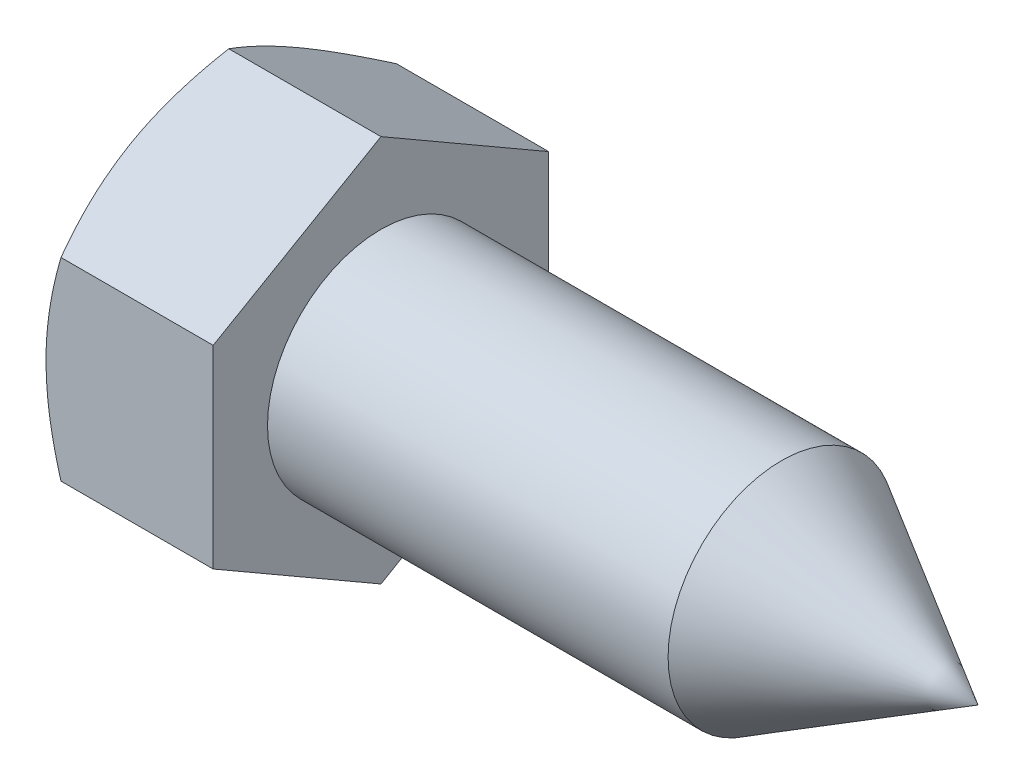
ISO-10303-21;
HEADER;
FILE_DESCRIPTION(('STEP AP214'),'2;1');
FILE_NAME('part.step','',(''),(''),'','','');
FILE_SCHEMA(('AUTOMOTIVE_DESIGN { 1 0 10303 214 1 1 1 1 }'));
ENDSEC;
DATA;
#1=APPLICATION_CONTEXT('core data for automotive mechanical design processes');
#2=APPLICATION_PROTOCOL_DEFINITION('international standard','automotive_design',2000,#1);
#3=PRODUCT_CONTEXT('',#1,'mechanical');
#4=PRODUCT('Part','Part','',(#3));
#5=PRODUCT_RELATED_PRODUCT_CATEGORY('part','',(#4));
#6=PRODUCT_DEFINITION_FORMATION('','',#4);
#7=PRODUCT_DEFINITION_CONTEXT('part definition',#1,'design');
#8=PRODUCT_DEFINITION('design','',#6,#7);
#9=PRODUCT_DEFINITION_SHAPE('','',#8);
#10=(LENGTH_UNIT() NAMED_UNIT(*) SI_UNIT(.MILLI.,.METRE.));
#11=(NAMED_UNIT(*) PLANE_ANGLE_UNIT() SI_UNIT($,.RADIAN.));
#12=(NAMED_UNIT(*) SI_UNIT($,.STERADIAN.) SOLID_ANGLE_UNIT());
#13=UNCERTAINTY_MEASURE_WITH_UNIT(LENGTH_MEASURE(1.E-05),#10,'distance_accuracy_value','');
#14=(GEOMETRIC_REPRESENTATION_CONTEXT(3) GLOBAL_UNCERTAINTY_ASSIGNED_CONTEXT((#13)) GLOBAL_UNIT_ASSIGNED_CONTEXT((#10,
#11,#12)) REPRESENTATION_CONTEXT('',''));
#15=CARTESIAN_POINT('',(0.,0.,0.));
#16=DIRECTION('',(0.,0.,1.));
#17=DIRECTION('',(1.,0.,0.));
#18=AXIS2_PLACEMENT_3D('',#15,#16,#17);
#19=CARTESIAN_POINT('',(3.556,2.06038990565702,-3.5687));
#20=DIRECTION('',(0.,-0.866025403784438,0.500000000000001));
#21=DIRECTION('',(0.,-0.500000000000001,-0.866025403784438));
#22=AXIS2_PLACEMENT_3D('',#19,#20,#21);
#23=PLANE('',#22);
#24=CARTESIAN_POINT('',(0.318810097145046,4.12089528136788,0.0002));
#25=CARTESIAN_POINT('',(0.266515217416026,4.03035167450494,-0.156626127387163));
#26=CARTESIAN_POINT('',(0.218954924924666,3.93902650081488,-0.314805968228382));
#27=CARTESIAN_POINT('',(0.135937943389388,3.75479476029581,-0.633904703174268));
#28=CARTESIAN_POINT('',(0.100510622721651,3.6618849199142,-0.794829267238323));
#29=CARTESIAN_POINT('',(0.045362817821156,3.47721668274375,-1.11468403656172));
#30=CARTESIAN_POINT('',(0.0252752961132202,3.38548669950588,-1.27356502810715));
#31=CARTESIAN_POINT('',(0.00129493211348879,3.20159510929359,-1.59207460543947));
#32=CARTESIAN_POINT('',(-0.00261776794875633,3.10943417072098,-1.75170203352046));
#33=CARTESIAN_POINT('',(0.00552175541747567,2.93722612416988,-2.04997511961916));
#34=CARTESIAN_POINT('',(0.0155754497043311,2.85715323807381,-2.18866542664622));
#35=CARTESIAN_POINT('',(0.0474398366827768,2.69752914050718,-2.46514247374396));
#36=CARTESIAN_POINT('',(0.0692614144390112,2.61797848115061,-2.60292825752515));
#37=CARTESIAN_POINT('',(0.123813701157124,2.45802526555895,-2.87997535376391));
#38=CARTESIAN_POINT('',(0.156775656949125,2.37764295409555,-3.01920160124835));
#39=CARTESIAN_POINT('',(0.231586346267413,2.21807721924434,-3.29557756115772));
#40=CARTESIAN_POINT('',(0.273417501690484,2.13889175156046,-3.43273081440729));
#41=CARTESIAN_POINT('',(0.318810097145042,2.06027443560318,-3.5689));
#42=B_SPLINE_CURVE_WITH_KNOTS('',3,(#24,#25,#26,#27,#28,#29,#30,#31,#32,#33,#34,#35,#36,#37,#38,
#39,#40,#41),.UNSPECIFIED.,.F.,.F.,(4,2,2,2,2,2,2,2,4),(0.,0.565683332870988,1.1327264057399,
1.6857353770667,2.23806521926908,2.71899067080617,3.20036173401453,3.69241045370838,
4.18349293555236),.UNSPECIFIED.);
#43=CARTESIAN_POINT('',(0.318743427676317,4.12077981131404,0.));
#44=VERTEX_POINT('',#43);
#45=CARTESIAN_POINT('',(0.,3.09058485848552,-1.78435000000001));
#46=VERTEX_POINT('',#45);
#47=EDGE_CURVE('E53',#44,#46,#42,.T.);
#48=ORIENTED_EDGE('',*,*,#47,.F.);
#49=DIRECTION('',(-1.,0.,0.));
#50=VECTOR('',#49,1.);
#51=CARTESIAN_POINT('',(3.556,4.12077981131404,0.));
#52=LINE('',#51,#50);
#53=CARTESIAN_POINT('',(3.556,4.12077981131404,0.));
#54=VERTEX_POINT('',#53);
#55=EDGE_CURVE('E152',#54,#44,#52,.T.);
#56=ORIENTED_EDGE('',*,*,#55,.F.);
#57=DIRECTION('',(0.,0.500000000000001,0.866025403784438));
#58=VECTOR('',#57,1.);
#59=CARTESIAN_POINT('',(3.556,2.06038990565702,-3.5687));
#60=LINE('',#59,#58);
#61=CARTESIAN_POINT('',(3.556,2.06038990565702,-3.5687));
#62=VERTEX_POINT('',#61);
#63=EDGE_CURVE('E243',#62,#54,#60,.T.);
#64=ORIENTED_EDGE('',*,*,#63,.F.);
#65=DIRECTION('',(-1.,0.,0.));
#66=VECTOR('',#65,1.);
#67=CARTESIAN_POINT('',(3.556,2.06038990565702,-3.5687));
#68=LINE('',#67,#66);
#69=CARTESIAN_POINT('',(0.318743427676313,2.06038990565702,-3.5687));
#70=VERTEX_POINT('',#69);
#71=EDGE_CURVE('E140',#62,#70,#68,.T.);
#72=ORIENTED_EDGE('',*,*,#71,.T.);
#73=EDGE_CURVE('E134',#46,#70,#42,.T.);
#74=ORIENTED_EDGE('',*,*,#73,.F.);
#75=EDGE_LOOP('',(#48,#56,#64,#72,#74));
#76=FACE_BOUND('',#75,.T.);
#77=ADVANCED_FACE('F37',(#76),#23,.F.);
#78=CARTESIAN_POINT('',(3.556,4.12077981131404,0.));
#79=DIRECTION('',(0.,-0.866025403784438,-0.500000000000001));
#80=DIRECTION('',(0.,0.500000000000001,-0.866025403784438));
#81=AXIS2_PLACEMENT_3D('',#78,#79,#80);
#82=PLANE('',#81);
#83=CARTESIAN_POINT('',(0.318810097145043,2.06027443560318,3.5689));
#84=CARTESIAN_POINT('',(0.266515217416023,2.15081804246613,3.41207387261284));
#85=CARTESIAN_POINT('',(0.218954924924663,2.24214321615618,3.25389403177162));
#86=CARTESIAN_POINT('',(0.135937943389386,2.42637495667525,2.93479529682573));
#87=CARTESIAN_POINT('',(0.100510622721649,2.51928479705686,2.77387073276168));
#88=CARTESIAN_POINT('',(0.0453628178211547,2.70395303422731,2.45401596343828));
#89=CARTESIAN_POINT('',(0.0252752961132193,2.79568301746518,2.29513497189285));
#90=CARTESIAN_POINT('',(0.00129493211348872,2.97957460767747,1.97662539456053));
#91=CARTESIAN_POINT('',(-0.0026177679487559,3.07173554625007,1.81699796647954));
#92=CARTESIAN_POINT('',(0.00552175541747694,3.24394359280118,1.51872488038084));
#93=CARTESIAN_POINT('',(0.0155754497043328,3.32401647889725,1.38003457335378));
#94=CARTESIAN_POINT('',(0.0474398366827791,3.48364057646388,1.10355752625604));
#95=CARTESIAN_POINT('',(0.0692614144390138,3.56319123582045,0.96577174247485));
#96=CARTESIAN_POINT('',(0.123813701157127,3.72314445141211,0.688724646236087));
#97=CARTESIAN_POINT('',(0.156775656949128,3.80352676287551,0.549498398751652));
#98=CARTESIAN_POINT('',(0.231586346267417,3.96309249772672,0.273122438842281));
#99=CARTESIAN_POINT('',(0.273417501690488,4.04227796541059,0.135969185592712));
#100=CARTESIAN_POINT('',(0.318810097145046,4.12089528136788,-0.000200000000000131));
#101=B_SPLINE_CURVE_WITH_KNOTS('',3,(#83,#84,#85,#86,#87,#88,#89,#90,#91,#92,#93,#94,#95,#96,
#97,#98,#99,#100),.UNSPECIFIED.,.F.,.F.,(4,2,2,2,2,2,2,2,4),(0.,0.565683332870988,
1.13272640573989,1.6857353770667,2.23806521926908,2.71899067080616,3.20036173401453,
3.69241045370838,4.18349293555236),.UNSPECIFIED.);
#102=CARTESIAN_POINT('',(0.318743427676313,2.06038990565702,3.5687));
#103=VERTEX_POINT('',#102);
#104=CARTESIAN_POINT('',(0.,3.09058485848552,1.78435));
#105=VERTEX_POINT('',#104);
#106=EDGE_CURVE('E60',#103,#105,#101,.T.);
#107=ORIENTED_EDGE('',*,*,#106,.F.);
#108=DIRECTION('',(-1.,0.,0.));
#109=VECTOR('',#108,1.);
#110=CARTESIAN_POINT('',(3.556,2.06038990565702,3.5687));
#111=LINE('',#110,#109);
#112=CARTESIAN_POINT('',(3.556,2.06038990565702,3.5687));
#113=VERTEX_POINT('',#112);
#114=EDGE_CURVE('E150',#113,#103,#111,.T.);
#115=ORIENTED_EDGE('',*,*,#114,.F.);
#116=DIRECTION('',(0.,-0.500000000000001,0.866025403784438));
#117=VECTOR('',#116,1.);
#118=CARTESIAN_POINT('',(3.556,4.12077981131404,0.));
#119=LINE('',#118,#117);
#120=EDGE_CURVE('E241',#54,#113,#119,.T.);
#121=ORIENTED_EDGE('',*,*,#120,.F.);
#122=ORIENTED_EDGE('',*,*,#55,.T.);
#123=EDGE_CURVE('E167',#105,#44,#101,.T.);
#124=ORIENTED_EDGE('',*,*,#123,.F.);
#125=EDGE_LOOP('',(#107,#115,#121,#122,#124));
#126=FACE_BOUND('',#125,.T.);
#127=ADVANCED_FACE('F173',(#126),#82,.F.);
#128=CARTESIAN_POINT('',(3.556,2.06038990565702,3.5687));
#129=DIRECTION('',(0.,0.,-1.));
#130=DIRECTION('',(0.,1.,0.));
#131=AXIS2_PLACEMENT_3D('',#128,#129,#130);
#132=PLANE('',#131);
#133=CARTESIAN_POINT('',(1.74622749310814,-5.54395061050737,3.5687));
#134=CARTESIAN_POINT('',(1.67051777621743,-5.38795550484438,3.5687));
#135=CARTESIAN_POINT('',(1.5955314429353,-5.23160321945791,3.5687));
#136=CARTESIAN_POINT('',(1.44741236458266,-4.91799428717788,3.5687));
#137=CARTESIAN_POINT('',(1.3742799102078,-4.76073750314063,3.5687));
#138=CARTESIAN_POINT('',(1.22990977600629,-4.44432444545381,3.5687));
#139=CARTESIAN_POINT('',(1.15868448832882,-4.28516249810118,3.5687));
#140=CARTESIAN_POINT('',(1.01913753814225,-3.96557544301869,3.5687));
#141=CARTESIAN_POINT('',(0.95081573881303,-3.80515039523269,3.5687));
#142=CARTESIAN_POINT('',(0.815731463186701,-3.47766449003495,3.5687));
#143=CARTESIAN_POINT('',(0.749087240852181,-3.31055458761518,3.5687));
#144=CARTESIAN_POINT('',(0.620819773725147,-2.97438349497214,3.5687));
#145=CARTESIAN_POINT('',(0.559197090615692,-2.80532208887186,3.5687));
#146=CARTESIAN_POINT('',(0.442582712862686,-2.46529194908488,3.5687));
#147=CARTESIAN_POINT('',(0.387577702535766,-2.2943278282071,3.5687));
#148=CARTESIAN_POINT('',(0.285956965795507,-1.94994775659267,3.5687));
#149=CARTESIAN_POINT('',(0.23933860938547,-1.7765325929499,3.5687));
#150=CARTESIAN_POINT('',(0.156957853670324,-1.42806668033393,3.5687));
#151=CARTESIAN_POINT('',(0.12113920966847,-1.25302947710717,3.5687));
#152=CARTESIAN_POINT('',(0.0623938669874265,-0.900769393934736,3.5687));
#153=CARTESIAN_POINT('',(0.0394658448948095,-0.72354674026776,3.5687));
#154=CARTESIAN_POINT('',(0.00863023714905464,-0.37011966721301,3.5687));
#155=CARTESIAN_POINT('',(0.000528744656555413,-0.193932593095181,3.5687));
#156=CARTESIAN_POINT('',(-0.000477974142601491,0.158502507405787,3.5687));
#157=CARTESIAN_POINT('',(0.0066173083203833,0.334750535632083,3.5687));
#158=CARTESIAN_POINT('',(0.0310306729024779,0.633605639042993,3.5687));
#159=CARTESIAN_POINT('',(0.044668243102702,0.756531848847546,3.5687));
#160=CARTESIAN_POINT('',(0.0784929317357435,1.00148593248935,3.5687));
#161=CARTESIAN_POINT('',(0.0986809268438413,1.12351368384465,3.5687));
#162=CARTESIAN_POINT('',(0.168009386367951,1.4880788364708,3.5687));
#163=CARTESIAN_POINT('',(0.225902503056639,1.72897038443455,3.5687));
#164=CARTESIAN_POINT('',(0.326346974085599,2.08934043892819,3.5687));
#165=CARTESIAN_POINT('',(0.36259143061235,2.2106829045194,3.5687));
#166=CARTESIAN_POINT('',(0.438852048327797,2.45218827079757,3.5687));
#167=CARTESIAN_POINT('',(0.478868238605861,2.57235116237922,3.5687));
#168=CARTESIAN_POINT('',(0.56202932500522,2.81153787870989,3.5687));
#169=CARTESIAN_POINT('',(0.605173252886895,2.93056204316328,3.5687));
#170=CARTESIAN_POINT('',(0.694081320859438,3.16762124759599,3.5687));
#171=CARTESIAN_POINT('',(0.739845397472404,3.28565631145873,3.5687));
#172=CARTESIAN_POINT('',(0.869419332026504,3.61086868189307,3.5687));
#173=CARTESIAN_POINT('',(0.955538742219887,3.81712501305578,3.5687));
#174=CARTESIAN_POINT('',(1.13276906643576,4.2274898596246,3.5687));
#175=CARTESIAN_POINT('',(1.22388055613104,4.43159812407269,3.5687));
#176=CARTESIAN_POINT('',(1.40987223379174,4.83817281264892,3.5687));
#177=CARTESIAN_POINT('',(1.50475375772842,5.040638623585,3.5687));
#178=CARTESIAN_POINT('',(1.69736644071166,5.44421306340702,3.5687));
#179=CARTESIAN_POINT('',(1.79509768649081,5.64532165075536,3.5687));
#180=CARTESIAN_POINT('',(1.99292343206925,6.04676617423498,3.5687));
#181=CARTESIAN_POINT('',(2.09302142430872,6.24710038583299,3.5687));
#182=CARTESIAN_POINT('',(2.29496624487297,6.64688632700477,3.5687));
#183=CARTESIAN_POINT('',(2.39681309095373,6.84633804759281,3.5687));
#184=CARTESIAN_POINT('',(2.70438335949638,7.44353118517559,3.5687));
#185=CARTESIAN_POINT('',(2.91218250565527,7.84020301723298,3.5687));
#186=CARTESIAN_POINT('',(3.30854582607472,8.58837693176025,3.5687));
#187=CARTESIAN_POINT('',(3.49673184692142,8.94008030006754,3.5687));
#188=CARTESIAN_POINT('',(3.8752366316608,9.64236601379057,3.5687));
#189=CARTESIAN_POINT('',(4.06555553119024,9.99294828606892,3.5687));
#190=CARTESIAN_POINT('',(4.44713172461165,10.6920944158896,3.5687));
#191=CARTESIAN_POINT('',(4.6383838237378,11.0406611128841,3.5687));
#192=CARTESIAN_POINT('',(5.02208870539511,11.7370971065676,3.5687));
#193=CARTESIAN_POINT('',(5.21454139112981,12.0849664565665,3.5687));
#194=CARTESIAN_POINT('',(5.40742954459759,12.432592743865,3.5687));
#195=B_SPLINE_CURVE_WITH_KNOTS('',3,(#133,#134,#135,#136,#137,#138,#139,#140,#141,#142,#143,
#144,#145,#146,#147,#148,#149,#150,#151,#152,#153,#154,#155,#156,#157,#158,#159,#160,#161,#162,
#163,#164,#165,#166,#167,#168,#169,#170,#171,#172,#173,#174,#175,#176,#177,#178,#179,#180,#181,
#182,#183,#184,#185,#186,#187,#188,#189,#190,#191,#192,#193,#194),.UNSPECIFIED.,.F.,.F.,(4,2,2,
2,2,2,2,2,2,2,2,2,2,2,2,2,2,2,2,2,2,2,2,2,2,2,2,2,2,2,4),(0.,0.520196580526777,1.04047423163276,
1.56356677288606,2.08663463722925,2.62629862327623,3.16602289068568,3.70464232035926,
4.24309254714775,4.77868807139239,5.3142285987713,5.84271366018351,6.37121641491286,
6.74207805688614,7.11298935356668,7.85519509466279,8.23508221948756,8.61497227441863,
8.99474522657963,9.37450898193517,10.0449485674567,10.7154656296046,11.3862224570472,
12.0569997206333,12.7288376204701,13.4006823454593,14.744062079393,15.9407096984922,
17.1374338531106,18.3301949306861,19.5228610545471),.UNSPECIFIED.);
#196=CARTESIAN_POINT('',(0.31874342767631,-2.060389905657,3.5687));
#197=VERTEX_POINT('',#196);
#198=CARTESIAN_POINT('',(0.,0.,3.5687));
#199=VERTEX_POINT('',#198);
#200=EDGE_CURVE('E250',#197,#199,#195,.T.);
#201=ORIENTED_EDGE('',*,*,#200,.F.);
#202=DIRECTION('',(-1.,0.,0.));
#203=VECTOR('',#202,1.);
#204=CARTESIAN_POINT('',(3.556,-2.060389905657,3.5687));
#205=LINE('',#204,#203);
#206=CARTESIAN_POINT('',(3.556,-2.060389905657,3.5687));
#207=VERTEX_POINT('',#206);
#208=EDGE_CURVE('E142',#207,#197,#205,.T.);
#209=ORIENTED_EDGE('',*,*,#208,.F.);
#210=DIRECTION('',(0.,-1.,0.));
#211=VECTOR('',#210,1.);
#212=CARTESIAN_POINT('',(3.556,2.06038990565702,3.5687));
#213=LINE('',#212,#211);
#214=EDGE_CURVE('E237',#113,#207,#213,.T.);
#215=ORIENTED_EDGE('',*,*,#214,.F.);
#216=ORIENTED_EDGE('',*,*,#114,.T.);
#217=EDGE_CURVE('E191',#199,#103,#195,.T.);
#218=ORIENTED_EDGE('',*,*,#217,.F.);
#219=EDGE_LOOP('',(#201,#209,#215,#216,#218));
#220=FACE_BOUND('',#219,.T.);
#221=ADVANCED_FACE('F256',(#220),#132,.F.);
#222=CARTESIAN_POINT('',(3.556,-4.12077981131403,0.));
#223=DIRECTION('',(0.,0.866025403784437,-0.500000000000002));
#224=DIRECTION('',(0.,0.500000000000002,0.866025403784437));
#225=AXIS2_PLACEMENT_3D('',#222,#223,#224);
#226=PLANE('',#225);
#227=CARTESIAN_POINT('',(0.318810097145041,-4.12089528136787,-0.000200000000000053));
#228=CARTESIAN_POINT('',(0.266515217416021,-4.03035167450493,0.156626127387163));
#229=CARTESIAN_POINT('',(0.21895492492466,-3.93902650081488,0.314805968228381));
#230=CARTESIAN_POINT('',(0.135937943389383,-3.7547947602958,0.633904703174266));
#231=CARTESIAN_POINT('',(0.100510622721646,-3.66188491991419,0.794829267238321));
#232=CARTESIAN_POINT('',(0.045362817821151,-3.47721668274375,1.11468403656171));
#233=CARTESIAN_POINT('',(0.0252752961132153,-3.38548669950588,1.27356502810715));
#234=CARTESIAN_POINT('',(0.00129493211348375,-3.20159510929359,1.59207460543947));
#235=CARTESIAN_POINT('',(-0.00261776794876141,-3.10943417072098,1.75170203352046));
#236=CARTESIAN_POINT('',(0.00552175541747051,-2.93722612416987,2.04997511961915));
#237=CARTESIAN_POINT('',(0.015575449704326,-2.8571532380738,2.18866542664622));
#238=CARTESIAN_POINT('',(0.0474398366827718,-2.69752914050717,2.46514247374396));
#239=CARTESIAN_POINT('',(0.0692614144390064,-2.6179784811506,2.60292825752515));
#240=CARTESIAN_POINT('',(0.123813701157119,-2.45802526555894,2.87997535376391));
#241=CARTESIAN_POINT('',(0.156775656949121,-2.37764295409554,3.01920160124835));
#242=CARTESIAN_POINT('',(0.23158634626741,-2.21807721924432,3.29557756115772));
#243=CARTESIAN_POINT('',(0.273417501690481,-2.13889175156045,3.43273081440729));
#244=CARTESIAN_POINT('',(0.318810097145039,-2.06027443560317,3.5689));
#245=B_SPLINE_CURVE_WITH_KNOTS('',3,(#227,#228,#229,#230,#231,#232,#233,#234,#235,#236,#237,
#238,#239,#240,#241,#242,#243,#244),.UNSPECIFIED.,.F.,.F.,(4,2,2,2,2,2,2,2,4),(0.,
0.565683332870987,1.13272640573989,1.6857353770667,2.23806521926908,2.71899067080617,
3.20036173401453,3.69241045370838,4.18349293555237),.UNSPECIFIED.);
#246=CARTESIAN_POINT('',(0.318743427676312,-4.12077981131403,0.));
#247=VERTEX_POINT('',#246);
#248=CARTESIAN_POINT('',(0.,-3.09058485848552,1.78435000000001));
#249=VERTEX_POINT('',#248);
#250=EDGE_CURVE('E175',#247,#249,#245,.T.);
#251=ORIENTED_EDGE('',*,*,#250,.F.);
#252=DIRECTION('',(-1.,0.,0.));
#253=VECTOR('',#252,1.);
#254=CARTESIAN_POINT('',(3.556,-4.12077981131403,0.));
#255=LINE('',#254,#253);
#256=CARTESIAN_POINT('',(3.556,-4.12077981131403,0.));
#257=VERTEX_POINT('',#256);
#258=EDGE_CURVE('E139',#257,#247,#255,.T.);
#259=ORIENTED_EDGE('',*,*,#258,.F.);
#260=DIRECTION('',(0.,-0.500000000000002,-0.866025403784438));
#261=VECTOR('',#260,1.);
#262=CARTESIAN_POINT('',(3.556,-4.12077981131403,0.));
#263=LINE('',#262,#261);
#264=EDGE_CURVE('E235',#207,#257,#263,.T.);
#265=ORIENTED_EDGE('',*,*,#264,.F.);
#266=ORIENTED_EDGE('',*,*,#208,.T.);
#267=EDGE_CURVE('E177',#249,#197,#245,.T.);
#268=ORIENTED_EDGE('',*,*,#267,.F.);
#269=EDGE_LOOP('',(#251,#259,#265,#266,#268));
#270=FACE_BOUND('',#269,.T.);
#271=ADVANCED_FACE('F231',(#270),#226,.F.);
#272=CARTESIAN_POINT('',(3.556,-2.06038990565702,-3.5687));
#273=DIRECTION('',(0.,0.866025403784439,0.5));
#274=DIRECTION('',(0.,-0.5,0.866025403784439));
#275=AXIS2_PLACEMENT_3D('',#272,#273,#274);
#276=PLANE('',#275);
#277=CARTESIAN_POINT('',(0.318810097145043,-2.06027443560318,-3.5689));
#278=CARTESIAN_POINT('',(0.266515217416023,-2.15081804246612,-3.41207387261284));
#279=CARTESIAN_POINT('',(0.218954924924662,-2.24214321615617,-3.25389403177162));
#280=CARTESIAN_POINT('',(0.135937943389385,-2.42637495667525,-2.93479529682573));
#281=CARTESIAN_POINT('',(0.100510622721647,-2.51928479705686,-2.77387073276168));
#282=CARTESIAN_POINT('',(0.0453628178211531,-2.7039530342273,-2.45401596343828));
#283=CARTESIAN_POINT('',(0.0252752961132176,-2.79568301746517,-2.29513497189285));
#284=CARTESIAN_POINT('',(0.00129493211348677,-2.97957460767746,-1.97662539456053));
#285=CARTESIAN_POINT('',(-0.00261776794875798,-3.07173554625007,-1.81699796647954));
#286=CARTESIAN_POINT('',(0.00552175541747431,-3.24394359280117,-1.51872488038084));
#287=CARTESIAN_POINT('',(0.0155754497043297,-3.32401647889724,-1.38003457335378));
#288=CARTESIAN_POINT('',(0.0474398366827754,-3.48364057646387,-1.10355752625604));
#289=CARTESIAN_POINT('',(0.0692614144390098,-3.56319123582045,-0.965771742474849));
#290=CARTESIAN_POINT('',(0.123813701157123,-3.7231444514121,-0.688724646236087));
#291=CARTESIAN_POINT('',(0.156775656949124,-3.8035267628755,-0.549498398751653));
#292=CARTESIAN_POINT('',(0.231586346267412,-3.96309249772671,-0.273122438842281));
#293=CARTESIAN_POINT('',(0.273417501690484,-4.04227796541059,-0.135969185592713));
#294=CARTESIAN_POINT('',(0.318810097145041,-4.12089528136787,0.000199999999999654));
#295=B_SPLINE_CURVE_WITH_KNOTS('',3,(#277,#278,#279,#280,#281,#282,#283,#284,#285,#286,#287,
#288,#289,#290,#291,#292,#293,#294),.UNSPECIFIED.,.F.,.F.,(4,2,2,2,2,2,2,2,4),(0.,
0.565683332870987,1.13272640573989,1.6857353770667,2.23806521926908,2.71899067080617,
3.20036173401452,3.69241045370838,4.18349293555236),.UNSPECIFIED.);
#296=CARTESIAN_POINT('',(0.318743427675983,-2.06038990565751,-3.5687));
#297=VERTEX_POINT('',#296);
#298=CARTESIAN_POINT('',(0.,-3.09058485848553,-1.78435));
#299=VERTEX_POINT('',#298);
#300=EDGE_CURVE('E116',#297,#299,#295,.T.);
#301=ORIENTED_EDGE('',*,*,#300,.F.);
#302=DIRECTION('',(-1.,0.,0.));
#303=VECTOR('',#302,1.);
#304=CARTESIAN_POINT('',(3.556,-2.06038990565702,-3.5687));
#305=LINE('',#304,#303);
#306=CARTESIAN_POINT('',(3.556,-2.06038990565702,-3.5687));
#307=VERTEX_POINT('',#306);
#308=EDGE_CURVE('E130',#307,#297,#305,.T.);
#309=ORIENTED_EDGE('',*,*,#308,.F.);
#310=DIRECTION('',(0.,0.5,-0.866025403784439));
#311=VECTOR('',#310,1.);
#312=CARTESIAN_POINT('',(3.556,-2.06038990565702,-3.5687));
#313=LINE('',#312,#311);
#314=EDGE_CURVE('E233',#257,#307,#313,.T.);
#315=ORIENTED_EDGE('',*,*,#314,.F.);
#316=ORIENTED_EDGE('',*,*,#258,.T.);
#317=EDGE_CURVE('E133',#299,#247,#295,.T.);
#318=ORIENTED_EDGE('',*,*,#317,.F.);
#319=EDGE_LOOP('',(#301,#309,#315,#316,#318));
#320=FACE_BOUND('',#319,.T.);
#321=ADVANCED_FACE('F128',(#320),#276,.F.);
#322=CARTESIAN_POINT('',(3.556,2.06038990565702,-3.5687));
#323=DIRECTION('',(0.,0.,1.));
#324=DIRECTION('',(0.,-1.,0.));
#325=AXIS2_PLACEMENT_3D('',#322,#323,#324);
#326=PLANE('',#325);
#327=CARTESIAN_POINT('',(1.74622749310814,-5.54395061050738,-3.5687));
#328=CARTESIAN_POINT('',(1.67051777621744,-5.3879555048444,-3.5687));
#329=CARTESIAN_POINT('',(1.59553144293531,-5.23160321945793,-3.5687));
#330=CARTESIAN_POINT('',(1.44741236458266,-4.91799428717789,-3.5687));
#331=CARTESIAN_POINT('',(1.37427991020781,-4.76073750314065,-3.5687));
#332=CARTESIAN_POINT('',(1.2299097760063,-4.44432444545382,-3.5687));
#333=CARTESIAN_POINT('',(1.15868448832883,-4.28516249810119,-3.5687));
#334=CARTESIAN_POINT('',(1.01913753814226,-3.9655754430187,-3.5687));
#335=CARTESIAN_POINT('',(0.950815738813036,-3.8051503952327,-3.5687));
#336=CARTESIAN_POINT('',(0.815731463186706,-3.47766449003496,-3.5687));
#337=CARTESIAN_POINT('',(0.749087240852186,-3.31055458761519,-3.5687));
#338=CARTESIAN_POINT('',(0.620819773725152,-2.97438349497216,-3.5687));
#339=CARTESIAN_POINT('',(0.559197090615696,-2.80532208887187,-3.5687));
#340=CARTESIAN_POINT('',(0.44258271286269,-2.46529194908489,-3.5687));
#341=CARTESIAN_POINT('',(0.387577702535769,-2.29432782820711,-3.5687));
#342=CARTESIAN_POINT('',(0.28595696579551,-1.94994775659268,-3.5687));
#343=CARTESIAN_POINT('',(0.239338609385473,-1.77653259294992,-3.5687));
#344=CARTESIAN_POINT('',(0.156957853670326,-1.42806668033394,-3.5687));
#345=CARTESIAN_POINT('',(0.121139209668472,-1.25302947710718,-3.5687));
#346=CARTESIAN_POINT('',(0.0623938669874281,-0.900769393934747,-3.5687));
#347=CARTESIAN_POINT('',(0.0394658448948109,-0.723546740267771,-3.5687));
#348=CARTESIAN_POINT('',(0.00863023714905545,-0.37011966721302,-3.5687));
#349=CARTESIAN_POINT('',(0.000528744656555899,-0.19393259309519,-3.5687));
#350=CARTESIAN_POINT('',(-0.000477974142601728,0.158502507405778,-3.5687));
#351=CARTESIAN_POINT('',(0.00661730832038263,0.334750535632074,-3.5687));
#352=CARTESIAN_POINT('',(0.0310306729024769,0.633605639042984,-3.5687));
#353=CARTESIAN_POINT('',(0.0446682431027009,0.756531848847536,-3.5687));
#354=CARTESIAN_POINT('',(0.0784929317357421,1.00148593248934,-3.5687));
#355=CARTESIAN_POINT('',(0.0986809268438397,1.12351368384464,-3.5687));
#356=CARTESIAN_POINT('',(0.168009386367949,1.48807883647079,-3.5687));
#357=CARTESIAN_POINT('',(0.225902503056636,1.72897038443454,-3.5687));
#358=CARTESIAN_POINT('',(0.326346974085595,2.08934043892817,-3.5687));
#359=CARTESIAN_POINT('',(0.362591430612346,2.21068290451938,-3.5687));
#360=CARTESIAN_POINT('',(0.438852048327793,2.45218827079756,-3.5687));
#361=CARTESIAN_POINT('',(0.478868238605856,2.57235116237921,-3.5687));
#362=CARTESIAN_POINT('',(0.562029325005216,2.81153787870988,-3.5687));
#363=CARTESIAN_POINT('',(0.60517325288689,2.93056204316326,-3.5687));
#364=CARTESIAN_POINT('',(0.694081320859433,3.16762124759597,-3.5687));
#365=CARTESIAN_POINT('',(0.739845397472398,3.28565631145871,-3.5687));
#366=CARTESIAN_POINT('',(0.869419332026498,3.61086868189305,-3.5687));
#367=CARTESIAN_POINT('',(0.955538742219881,3.81712501305576,-3.5687));
#368=CARTESIAN_POINT('',(1.13276906643576,4.22748985962458,-3.5687));
#369=CARTESIAN_POINT('',(1.22388055613104,4.43159812407268,-3.5687));
#370=CARTESIAN_POINT('',(1.40987223379174,4.83817281264891,-3.5687));
#371=CARTESIAN_POINT('',(1.50475375772841,5.04063862358499,-3.5687));
#372=CARTESIAN_POINT('',(1.69736644071165,5.44421306340701,-3.5687));
#373=CARTESIAN_POINT('',(1.7950976864908,5.64532165075534,-3.5687));
#374=CARTESIAN_POINT('',(1.99292343206925,6.04676617423497,-3.5687));
#375=CARTESIAN_POINT('',(2.09302142430871,6.24710038583298,-3.5687));
#376=CARTESIAN_POINT('',(2.29496624487297,6.64688632700476,-3.5687));
#377=CARTESIAN_POINT('',(2.39681309095373,6.8463380475928,-3.5687));
#378=CARTESIAN_POINT('',(2.70438335949638,7.44353118517558,-3.5687));
#379=CARTESIAN_POINT('',(2.91218250565527,7.84020301723298,-3.5687));
#380=CARTESIAN_POINT('',(3.30854582607471,8.58837693176025,-3.5687));
#381=CARTESIAN_POINT('',(3.49673184692142,8.94008030006753,-3.5687));
#382=CARTESIAN_POINT('',(3.8752366316608,9.64236601379056,-3.5687));
#383=CARTESIAN_POINT('',(4.06555553119024,9.99294828606891,-3.5687));
#384=CARTESIAN_POINT('',(4.44713172461165,10.6920944158896,-3.5687));
#385=CARTESIAN_POINT('',(4.6383838237378,11.0406611128841,-3.5687));
#386=CARTESIAN_POINT('',(5.02208870539511,11.7370971065676,-3.5687));
#387=CARTESIAN_POINT('',(5.21454139112981,12.0849664565665,-3.5687));
#388=CARTESIAN_POINT('',(5.4074295445976,12.432592743865,-3.5687));
#389=B_SPLINE_CURVE_WITH_KNOTS('',3,(#327,#328,#329,#330,#331,#332,#333,#334,#335,#336,#337,
#338,#339,#340,#341,#342,#343,#344,#345,#346,#347,#348,#349,#350,#351,#352,#353,#354,#355,#356,
#357,#358,#359,#360,#361,#362,#363,#364,#365,#366,#367,#368,#369,#370,#371,#372,#373,#374,#375,
#376,#377,#378,#379,#380,#381,#382,#383,#384,#385,#386,#387,#388),.UNSPECIFIED.,.F.,.F.,(4,2,2,
2,2,2,2,2,2,2,2,2,2,2,2,2,2,2,2,2,2,2,2,2,2,2,2,2,2,2,4),(0.,0.520196580526778,1.04047423163276,
1.56356677288606,2.08663463722926,2.62629862327623,3.16602289068568,3.70464232035926,
4.24309254714775,4.77868807139239,5.3142285987713,5.84271366018352,6.37121641491287,
6.74207805688614,7.11298935356669,7.85519509466279,8.23508221948756,8.61497227441863,
8.99474522657963,9.37450898193517,10.0449485674567,10.7154656296046,11.3862224570472,
12.0569997206333,12.7288376204701,13.4006823454594,14.744062079393,15.9407096984922,
17.1374338531106,18.3301949306861,19.5228610545471),.UNSPECIFIED.);
#390=CARTESIAN_POINT('',(0.,0.,-3.5687));
#391=VERTEX_POINT('',#390);
#392=EDGE_CURVE('E122',#70,#391,#389,.F.);
#393=ORIENTED_EDGE('',*,*,#392,.F.);
#394=ORIENTED_EDGE('',*,*,#71,.F.);
#395=DIRECTION('',(0.,1.,0.));
#396=VECTOR('',#395,1.);
#397=CARTESIAN_POINT('',(3.556,2.06038990565702,-3.5687));
#398=LINE('',#397,#396);
#399=EDGE_CURVE('E138',#307,#62,#398,.T.);
#400=ORIENTED_EDGE('',*,*,#399,.F.);
#401=ORIENTED_EDGE('',*,*,#308,.T.);
#402=EDGE_CURVE('E113',#391,#297,#389,.F.);
#403=ORIENTED_EDGE('',*,*,#402,.F.);
#404=EDGE_LOOP('',(#393,#394,#400,#401,#403));
#405=FACE_BOUND('',#404,.T.);
#406=ADVANCED_FACE('F136',(#405),#326,.F.);
#407=CARTESIAN_POINT('',(3.556,4.12077981131404,0.));
#408=DIRECTION('',(1.,0.,0.));
#409=DIRECTION('',(0.,0.,-1.));
#410=AXIS2_PLACEMENT_3D('',#407,#408,#409);
#411=PLANE('',#410);
#412=CARTESIAN_POINT('',(3.556,0.,0.));
#413=DIRECTION('',(1.,0.,0.));
#414=DIRECTION('',(0.,0.,-1.));
#415=AXIS2_PLACEMENT_3D('',#412,#413,#414);
#416=CIRCLE('',#415,2.413);
#417=CARTESIAN_POINT('',(3.556,0.,-2.413));
#418=VERTEX_POINT('',#417);
#419=EDGE_CURVE('E246',#418,#418,#416,.F.);
#420=ORIENTED_EDGE('',*,*,#419,.T.);
#421=EDGE_LOOP('',(#420));
#422=FACE_BOUND('',#421,.T.);
#423=ORIENTED_EDGE('',*,*,#63,.T.);
#424=ORIENTED_EDGE('',*,*,#120,.T.);
#425=ORIENTED_EDGE('',*,*,#214,.T.);
#426=ORIENTED_EDGE('',*,*,#264,.T.);
#427=ORIENTED_EDGE('',*,*,#314,.T.);
#428=ORIENTED_EDGE('',*,*,#399,.T.);
#429=EDGE_LOOP('',(#423,#424,#425,#426,#427,#428));
#430=FACE_BOUND('',#429,.T.);
#431=ADVANCED_FACE('F258',(#422,#430),#411,.T.);
#432=CARTESIAN_POINT('',(0.,0.,0.));
#433=DIRECTION('',(-1.,0.,0.));
#434=DIRECTION('',(0.,0.,1.));
#435=AXIS2_PLACEMENT_3D('',#432,#433,#434);
#436=CYLINDRICAL_SURFACE('',#435,2.413);
#437=ORIENTED_EDGE('',*,*,#419,.F.);
#438=EDGE_LOOP('',(#437));
#439=FACE_BOUND('',#438,.T.);
#440=CARTESIAN_POINT('',(12.0765614013363,0.,0.));
#441=DIRECTION('',(-1.,0.,0.));
#442=DIRECTION('',(0.,0.,1.));
#443=AXIS2_PLACEMENT_3D('',#440,#441,#442);
#444=CIRCLE('',#443,2.413);
#445=CARTESIAN_POINT('',(12.0765614013363,0.,2.413));
#446=VERTEX_POINT('',#445);
#447=EDGE_CURVE('E248',#446,#446,#444,.T.);
#448=ORIENTED_EDGE('',*,*,#447,.T.);
#449=EDGE_LOOP('',(#448));
#450=FACE_BOUND('',#449,.T.);
#451=ADVANCED_FACE('F288',(#439,#450),#436,.T.);
#452=CARTESIAN_POINT('',(16.256,0.,0.));
#453=DIRECTION('',(-1.,0.,0.));
#454=DIRECTION('',(0.,0.,1.));
#455=AXIS2_PLACEMENT_3D('',#452,#453,#454);
#456=CONICAL_SURFACE('',#455,0.,0.523598775598299);
#457=ORIENTED_EDGE('',*,*,#447,.F.);
#458=EDGE_LOOP('',(#457));
#459=FACE_BOUND('',#458,.T.);
#460=CARTESIAN_POINT('',(16.256,0.,0.));
#461=VERTEX_POINT('',#460);
#462=VERTEX_LOOP('',#461);
#463=FACE_BOUND('',#462,.T.);
#464=ADVANCED_FACE('F205',(#459,#463),#456,.T.);
#465=CARTESIAN_POINT('',(0.,0.,0.));
#466=DIRECTION('',(1.,0.,0.));
#467=DIRECTION('',(0.,0.,-1.));
#468=AXIS2_PLACEMENT_3D('',#465,#466,#467);
#469=CONICAL_SURFACE('',#468,3.5687,1.0471975511966);
#470=ORIENTED_EDGE('',*,*,#300,.T.);
#471=CARTESIAN_POINT('',(0.,0.,0.));
#472=DIRECTION('',(1.,0.,0.));
#473=DIRECTION('',(0.,0.,-1.));
#474=AXIS2_PLACEMENT_3D('',#471,#472,#473);
#475=CIRCLE('',#474,3.5687);
#476=EDGE_CURVE('E41',#299,#391,#475,.T.);
#477=ORIENTED_EDGE('',*,*,#476,.T.);
#478=ORIENTED_EDGE('',*,*,#402,.T.);
#479=EDGE_LOOP('',(#470,#477,#478));
#480=FACE_BOUND('',#479,.T.);
#481=ADVANCED_FACE('F115',(#480),#469,.T.);
#482=ORIENTED_EDGE('',*,*,#250,.T.);
#483=EDGE_CURVE('E157',#249,#299,#475,.T.);
#484=ORIENTED_EDGE('',*,*,#483,.T.);
#485=ORIENTED_EDGE('',*,*,#317,.T.);
#486=EDGE_LOOP('',(#482,#484,#485));
#487=FACE_BOUND('',#486,.T.);
#488=ADVANCED_FACE('F204',(#487),#469,.T.);
#489=ORIENTED_EDGE('',*,*,#200,.T.);
#490=EDGE_CURVE('E158',#199,#249,#475,.T.);
#491=ORIENTED_EDGE('',*,*,#490,.T.);
#492=ORIENTED_EDGE('',*,*,#267,.T.);
#493=EDGE_LOOP('',(#489,#491,#492));
#494=FACE_BOUND('',#493,.T.);
#495=ADVANCED_FACE('F199',(#494),#469,.T.);
#496=ORIENTED_EDGE('',*,*,#217,.T.);
#497=ORIENTED_EDGE('',*,*,#106,.T.);
#498=CARTESIAN_POINT('',(0.,0.,0.));
#499=DIRECTION('',(-1.,0.,0.));
#500=DIRECTION('',(0.,0.,1.));
#501=AXIS2_PLACEMENT_3D('',#498,#499,#500);
#502=CIRCLE('',#501,3.5687);
#503=EDGE_CURVE('E123',#199,#105,#502,.T.);
#504=ORIENTED_EDGE('',*,*,#503,.F.);
#505=EDGE_LOOP('',(#496,#497,#504));
#506=FACE_BOUND('',#505,.T.);
#507=ADVANCED_FACE('F203',(#506),#469,.T.);
#508=ORIENTED_EDGE('',*,*,#123,.T.);
#509=ORIENTED_EDGE('',*,*,#47,.T.);
#510=EDGE_CURVE('E46',#46,#105,#475,.T.);
#511=ORIENTED_EDGE('',*,*,#510,.T.);
#512=EDGE_LOOP('',(#508,#509,#511));
#513=FACE_BOUND('',#512,.T.);
#514=ADVANCED_FACE('F166',(#513),#469,.T.);
#515=ORIENTED_EDGE('',*,*,#73,.T.);
#516=ORIENTED_EDGE('',*,*,#392,.T.);
#517=EDGE_CURVE('E11',#391,#46,#475,.T.);
#518=ORIENTED_EDGE('',*,*,#517,.T.);
#519=EDGE_LOOP('',(#515,#516,#518));
#520=FACE_BOUND('',#519,.T.);
#521=ADVANCED_FACE('F261',(#520),#469,.T.);
#522=CARTESIAN_POINT('',(0.,4.12077981131404,0.));
#523=DIRECTION('',(1.,0.,0.));
#524=DIRECTION('',(0.,0.,-1.));
#525=AXIS2_PLACEMENT_3D('',#522,#523,#524);
#526=PLANE('',#525);
#527=ORIENTED_EDGE('',*,*,#517,.F.);
#528=ORIENTED_EDGE('',*,*,#476,.F.);
#529=ORIENTED_EDGE('',*,*,#483,.F.);
#530=ORIENTED_EDGE('',*,*,#490,.F.);
#531=ORIENTED_EDGE('',*,*,#503,.T.);
#532=ORIENTED_EDGE('',*,*,#510,.F.);
#533=EDGE_LOOP('',(#527,#528,#529,#530,#531,#532));
#534=FACE_BOUND('',#533,.T.);
#535=ADVANCED_FACE('F170',(#534),#526,.F.);
#536=CLOSED_SHELL('',(#77,#127,#221,#271,#321,#406,#431,#451,#464,#481,#488,#495,#507,#514,#521,#535));
#537=MANIFOLD_SOLID_BREP('B2',#536);
#538=ADVANCED_BREP_SHAPE_REPRESENTATION('',(#18,#537),#14);
#539=SHAPE_DEFINITION_REPRESENTATION(#9,#538);
ENDSEC;
END-ISO-10303-21;
